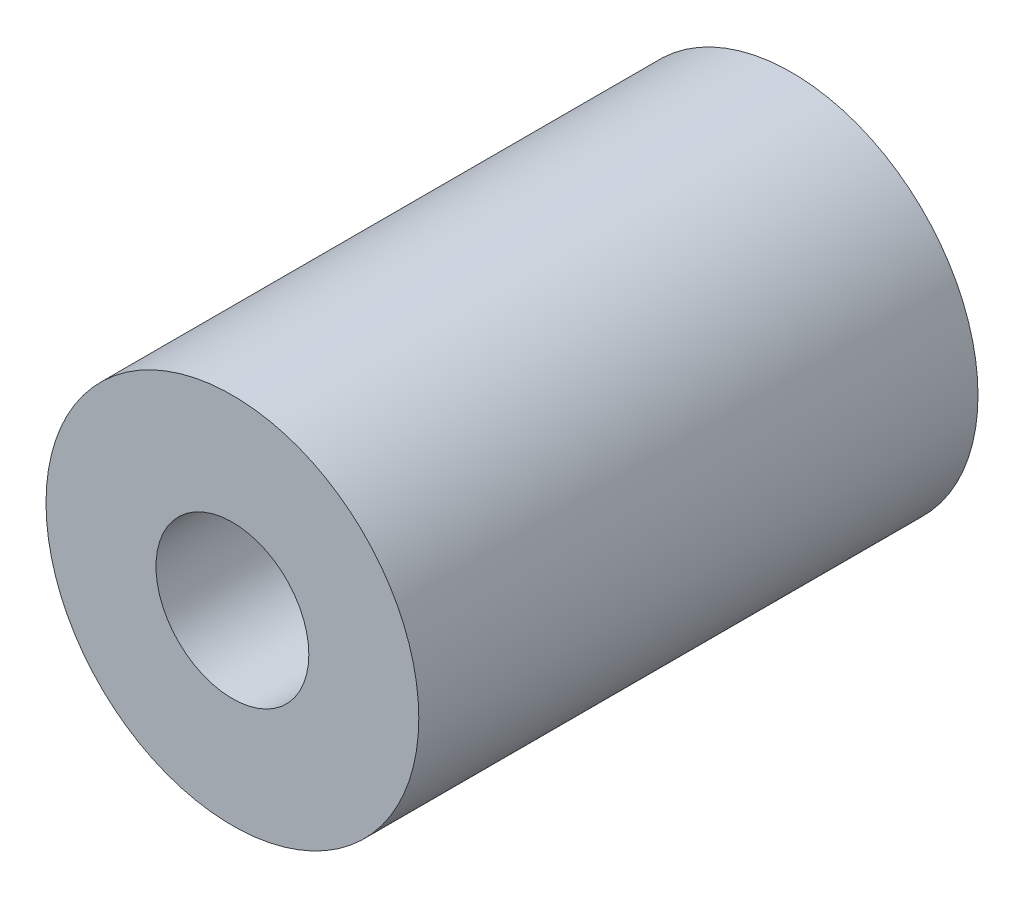
ISO-10303-21;
HEADER;
FILE_DESCRIPTION(('STEP AP214'),'2;1');
FILE_NAME('part.step','',(''),(''),'','','');
FILE_SCHEMA(('AUTOMOTIVE_DESIGN { 1 0 10303 214 1 1 1 1 }'));
ENDSEC;
DATA;
#1=APPLICATION_CONTEXT('core data for automotive mechanical design processes');
#2=APPLICATION_PROTOCOL_DEFINITION('international standard','automotive_design',2000,#1);
#3=PRODUCT_CONTEXT('',#1,'mechanical');
#4=PRODUCT('Part','Part','',(#3));
#5=PRODUCT_RELATED_PRODUCT_CATEGORY('part','',(#4));
#6=PRODUCT_DEFINITION_FORMATION('','',#4);
#7=PRODUCT_DEFINITION_CONTEXT('part definition',#1,'design');
#8=PRODUCT_DEFINITION('design','',#6,#7);
#9=PRODUCT_DEFINITION_SHAPE('','',#8);
#10=(LENGTH_UNIT() NAMED_UNIT(*) SI_UNIT(.MILLI.,.METRE.));
#11=(NAMED_UNIT(*) PLANE_ANGLE_UNIT() SI_UNIT($,.RADIAN.));
#12=(NAMED_UNIT(*) SI_UNIT($,.STERADIAN.) SOLID_ANGLE_UNIT());
#13=UNCERTAINTY_MEASURE_WITH_UNIT(LENGTH_MEASURE(1.E-05),#10,'distance_accuracy_value','');
#14=(GEOMETRIC_REPRESENTATION_CONTEXT(3) GLOBAL_UNCERTAINTY_ASSIGNED_CONTEXT((#13)) GLOBAL_UNIT_ASSIGNED_CONTEXT((#10,
#11,#12)) REPRESENTATION_CONTEXT('',''));
#15=CARTESIAN_POINT('',(0.,0.,0.));
#16=DIRECTION('',(0.,0.,1.));
#17=DIRECTION('',(1.,0.,0.));
#18=AXIS2_PLACEMENT_3D('',#15,#16,#17);
#19=CARTESIAN_POINT('',(0.,0.,30.));
#20=DIRECTION('',(0.,0.,1.));
#21=DIRECTION('',(1.,0.,0.));
#22=AXIS2_PLACEMENT_3D('',#19,#20,#21);
#23=PLANE('',#22);
#24=CARTESIAN_POINT('',(0.,0.,30.));
#25=DIRECTION('',(0.,0.,1.));
#26=DIRECTION('',(1.,0.,0.));
#27=AXIS2_PLACEMENT_3D('',#24,#25,#26);
#28=CIRCLE('',#27,10.);
#29=CARTESIAN_POINT('',(10.,0.,30.));
#30=VERTEX_POINT('',#29);
#31=EDGE_CURVE('E10',#30,#30,#28,.T.);
#32=ORIENTED_EDGE('',*,*,#31,.T.);
#33=EDGE_LOOP('',(#32));
#34=FACE_BOUND('',#33,.T.);
#35=CARTESIAN_POINT('',(0.,0.,30.));
#36=DIRECTION('',(0.,0.,1.));
#37=DIRECTION('',(1.,0.,0.));
#38=AXIS2_PLACEMENT_3D('',#35,#36,#37);
#39=CIRCLE('',#38,4.1);
#40=CARTESIAN_POINT('',(4.1,0.,30.));
#41=VERTEX_POINT('',#40);
#42=EDGE_CURVE('E56',#41,#41,#39,.T.);
#43=ORIENTED_EDGE('',*,*,#42,.F.);
#44=EDGE_LOOP('',(#43));
#45=FACE_BOUND('',#44,.T.);
#46=ADVANCED_FACE('F43',(#34,#45),#23,.T.);
#47=CARTESIAN_POINT('',(0.,0.,0.));
#48=DIRECTION('',(0.,0.,1.));
#49=DIRECTION('',(1.,0.,0.));
#50=AXIS2_PLACEMENT_3D('',#47,#48,#49);
#51=PLANE('',#50);
#52=CARTESIAN_POINT('',(0.,0.,0.));
#53=DIRECTION('',(0.,0.,1.));
#54=DIRECTION('',(1.,0.,0.));
#55=AXIS2_PLACEMENT_3D('',#52,#53,#54);
#56=CIRCLE('',#55,10.);
#57=CARTESIAN_POINT('',(10.,0.,0.));
#58=VERTEX_POINT('',#57);
#59=EDGE_CURVE('E47',#58,#58,#56,.T.);
#60=ORIENTED_EDGE('',*,*,#59,.F.);
#61=EDGE_LOOP('',(#60));
#62=FACE_BOUND('',#61,.T.);
#63=CARTESIAN_POINT('',(0.,0.,0.));
#64=DIRECTION('',(0.,0.,1.));
#65=DIRECTION('',(1.,0.,0.));
#66=AXIS2_PLACEMENT_3D('',#63,#64,#65);
#67=CIRCLE('',#66,4.1);
#68=CARTESIAN_POINT('',(4.1,0.,0.));
#69=VERTEX_POINT('',#68);
#70=EDGE_CURVE('E58',#69,#69,#67,.T.);
#71=ORIENTED_EDGE('',*,*,#70,.T.);
#72=EDGE_LOOP('',(#71));
#73=FACE_BOUND('',#72,.T.);
#74=ADVANCED_FACE('F70',(#62,#73),#51,.F.);
#75=CARTESIAN_POINT('',(0.,0.,30.));
#76=DIRECTION('',(0.,0.,-1.));
#77=DIRECTION('',(-1.,0.,0.));
#78=AXIS2_PLACEMENT_3D('',#75,#76,#77);
#79=CYLINDRICAL_SURFACE('',#78,10.);
#80=ORIENTED_EDGE('',*,*,#31,.F.);
#81=EDGE_LOOP('',(#80));
#82=FACE_BOUND('',#81,.T.);
#83=ORIENTED_EDGE('',*,*,#59,.T.);
#84=EDGE_LOOP('',(#83));
#85=FACE_BOUND('',#84,.T.);
#86=ADVANCED_FACE('F45',(#82,#85),#79,.T.);
#87=CARTESIAN_POINT('',(0.,0.,30.));
#88=DIRECTION('',(0.,0.,-1.));
#89=DIRECTION('',(-1.,0.,0.));
#90=AXIS2_PLACEMENT_3D('',#87,#88,#89);
#91=CYLINDRICAL_SURFACE('',#90,4.1);
#92=ORIENTED_EDGE('',*,*,#42,.T.);
#93=EDGE_LOOP('',(#92));
#94=FACE_BOUND('',#93,.T.);
#95=ORIENTED_EDGE('',*,*,#70,.F.);
#96=EDGE_LOOP('',(#95));
#97=FACE_BOUND('',#96,.T.);
#98=ADVANCED_FACE('F66',(#94,#97),#91,.F.);
#99=CLOSED_SHELL('',(#46,#74,#86,#98));
#100=MANIFOLD_SOLID_BREP('B2',#99);
#101=ADVANCED_BREP_SHAPE_REPRESENTATION('',(#18,#100),#14);
#102=SHAPE_DEFINITION_REPRESENTATION(#9,#101);
ENDSEC;
END-ISO-10303-21;
